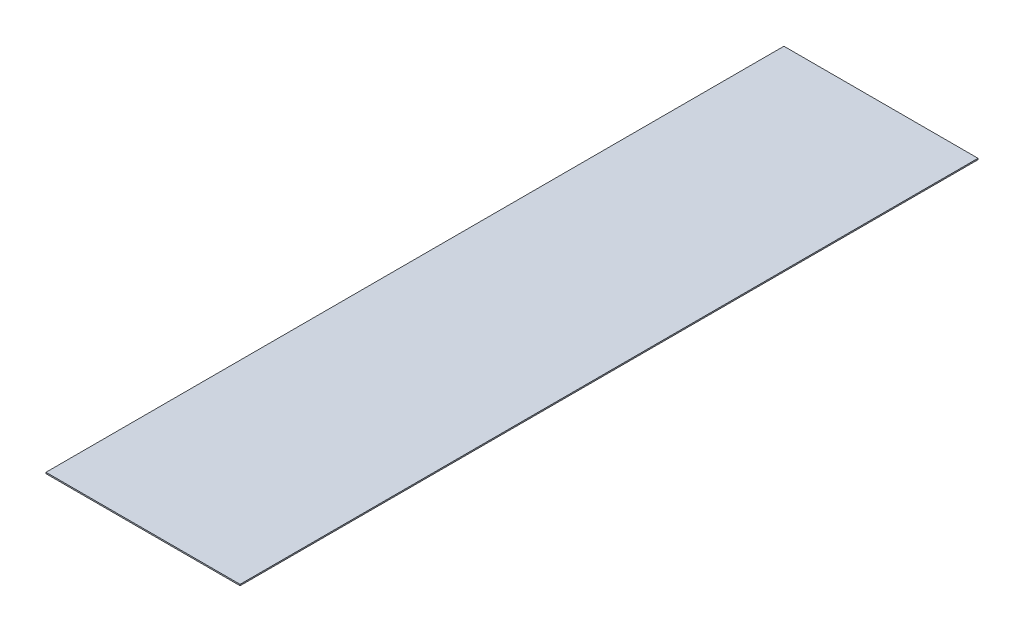
ISO-10303-21;
HEADER;
FILE_DESCRIPTION(('STEP AP214'),'2;1');
FILE_NAME('part.step','',(''),(''),'','','');
FILE_SCHEMA(('AUTOMOTIVE_DESIGN { 1 0 10303 214 1 1 1 1 }'));
ENDSEC;
DATA;
#1=APPLICATION_CONTEXT('core data for automotive mechanical design processes');
#2=APPLICATION_PROTOCOL_DEFINITION('international standard','automotive_design',2000,#1);
#3=PRODUCT_CONTEXT('',#1,'mechanical');
#4=PRODUCT('Part','Part','',(#3));
#5=PRODUCT_RELATED_PRODUCT_CATEGORY('part','',(#4));
#6=PRODUCT_DEFINITION_FORMATION('','',#4);
#7=PRODUCT_DEFINITION_CONTEXT('part definition',#1,'design');
#8=PRODUCT_DEFINITION('design','',#6,#7);
#9=PRODUCT_DEFINITION_SHAPE('','',#8);
#10=(LENGTH_UNIT() NAMED_UNIT(*) SI_UNIT(.MILLI.,.METRE.));
#11=(NAMED_UNIT(*) PLANE_ANGLE_UNIT() SI_UNIT($,.RADIAN.));
#12=(NAMED_UNIT(*) SI_UNIT($,.STERADIAN.) SOLID_ANGLE_UNIT());
#13=UNCERTAINTY_MEASURE_WITH_UNIT(LENGTH_MEASURE(1.E-05),#10,'distance_accuracy_value','');
#14=(GEOMETRIC_REPRESENTATION_CONTEXT(3) GLOBAL_UNCERTAINTY_ASSIGNED_CONTEXT((#13)) GLOBAL_UNIT_ASSIGNED_CONTEXT((#10,
#11,#12)) REPRESENTATION_CONTEXT('',''));
#15=CARTESIAN_POINT('',(0.,0.,0.));
#16=DIRECTION('',(0.,0.,1.));
#17=DIRECTION('',(1.,0.,0.));
#18=AXIS2_PLACEMENT_3D('',#15,#16,#17);
#19=CARTESIAN_POINT('',(240.506249999999,-1.58749999999999,1828.8));
#20=DIRECTION('',(-1.,0.,0.));
#21=DIRECTION('',(0.,0.,1.));
#22=AXIS2_PLACEMENT_3D('',#19,#20,#21);
#23=PLANE('',#22);
#24=DIRECTION('',(0.,1.,0.));
#25=VECTOR('',#24,1.);
#26=CARTESIAN_POINT('',(240.506249999999,-1.58749999999999,0.));
#27=LINE('',#26,#25);
#28=CARTESIAN_POINT('',(240.506249999999,-1.58749999999999,0.));
#29=VERTEX_POINT('',#28);
#30=CARTESIAN_POINT('',(240.506249999999,1.58750000000001,0.));
#31=VERTEX_POINT('',#30);
#32=EDGE_CURVE('E107',#29,#31,#27,.T.);
#33=ORIENTED_EDGE('',*,*,#32,.T.);
#34=DIRECTION('',(0.,0.,-1.));
#35=VECTOR('',#34,1.);
#36=CARTESIAN_POINT('',(240.506249999999,1.58750000000001,1828.8));
#37=LINE('',#36,#35);
#38=CARTESIAN_POINT('',(240.506249999999,1.58750000000001,1828.8));
#39=VERTEX_POINT('',#38);
#40=EDGE_CURVE('E11',#39,#31,#37,.T.);
#41=ORIENTED_EDGE('',*,*,#40,.F.);
#42=DIRECTION('',(0.,1.,0.));
#43=VECTOR('',#42,1.);
#44=CARTESIAN_POINT('',(240.506249999999,-1.58749999999999,1828.8));
#45=LINE('',#44,#43);
#46=CARTESIAN_POINT('',(240.506249999999,-1.58749999999999,1828.8));
#47=VERTEX_POINT('',#46);
#48=EDGE_CURVE('E91',#47,#39,#45,.T.);
#49=ORIENTED_EDGE('',*,*,#48,.F.);
#50=DIRECTION('',(0.,0.,-1.));
#51=VECTOR('',#50,1.);
#52=CARTESIAN_POINT('',(240.506249999999,-1.58749999999999,1828.8));
#53=LINE('',#52,#51);
#54=EDGE_CURVE('E103',#47,#29,#53,.T.);
#55=ORIENTED_EDGE('',*,*,#54,.T.);
#56=EDGE_LOOP('',(#33,#41,#49,#55));
#57=FACE_BOUND('',#56,.T.);
#58=ADVANCED_FACE('F39',(#57),#23,.F.);
#59=CARTESIAN_POINT('',(-240.506250000001,1.58750000000001,1828.8));
#60=DIRECTION('',(0.,-1.,0.));
#61=DIRECTION('',(0.,0.,-1.));
#62=AXIS2_PLACEMENT_3D('',#59,#60,#61);
#63=PLANE('',#62);
#64=DIRECTION('',(-1.,0.,0.));
#65=VECTOR('',#64,1.);
#66=CARTESIAN_POINT('',(-240.506250000001,1.58750000000001,0.));
#67=LINE('',#66,#65);
#68=CARTESIAN_POINT('',(-240.506250000001,1.58750000000001,0.));
#69=VERTEX_POINT('',#68);
#70=EDGE_CURVE('E96',#31,#69,#67,.T.);
#71=ORIENTED_EDGE('',*,*,#70,.T.);
#72=DIRECTION('',(0.,0.,-1.));
#73=VECTOR('',#72,1.);
#74=CARTESIAN_POINT('',(-240.506250000001,1.58750000000001,1828.8));
#75=LINE('',#74,#73);
#76=CARTESIAN_POINT('',(-240.506250000001,1.58750000000001,1828.8));
#77=VERTEX_POINT('',#76);
#78=EDGE_CURVE('E48',#77,#69,#75,.T.);
#79=ORIENTED_EDGE('',*,*,#78,.F.);
#80=DIRECTION('',(-1.,0.,0.));
#81=VECTOR('',#80,1.);
#82=CARTESIAN_POINT('',(-240.506250000001,1.58750000000001,1828.8));
#83=LINE('',#82,#81);
#84=EDGE_CURVE('E86',#39,#77,#83,.T.);
#85=ORIENTED_EDGE('',*,*,#84,.F.);
#86=ORIENTED_EDGE('',*,*,#40,.T.);
#87=EDGE_LOOP('',(#71,#79,#85,#86));
#88=FACE_BOUND('',#87,.T.);
#89=ADVANCED_FACE('F95',(#88),#63,.F.);
#90=CARTESIAN_POINT('',(-240.506250000001,-1.58749999999999,1828.8));
#91=DIRECTION('',(1.,0.,0.));
#92=DIRECTION('',(0.,0.,-1.));
#93=AXIS2_PLACEMENT_3D('',#90,#91,#92);
#94=PLANE('',#93);
#95=DIRECTION('',(0.,-1.,0.));
#96=VECTOR('',#95,1.);
#97=CARTESIAN_POINT('',(-240.506250000001,-1.58749999999999,0.));
#98=LINE('',#97,#96);
#99=CARTESIAN_POINT('',(-240.506250000001,-1.58749999999999,0.));
#100=VERTEX_POINT('',#99);
#101=EDGE_CURVE('E73',#69,#100,#98,.T.);
#102=ORIENTED_EDGE('',*,*,#101,.T.);
#103=DIRECTION('',(0.,0.,-1.));
#104=VECTOR('',#103,1.);
#105=CARTESIAN_POINT('',(-240.506250000001,-1.58749999999999,1828.8));
#106=LINE('',#105,#104);
#107=CARTESIAN_POINT('',(-240.506250000001,-1.58749999999999,1828.8));
#108=VERTEX_POINT('',#107);
#109=EDGE_CURVE('E98',#108,#100,#106,.T.);
#110=ORIENTED_EDGE('',*,*,#109,.F.);
#111=DIRECTION('',(0.,-1.,0.));
#112=VECTOR('',#111,1.);
#113=CARTESIAN_POINT('',(-240.506250000001,-1.58749999999999,1828.8));
#114=LINE('',#113,#112);
#115=EDGE_CURVE('E89',#77,#108,#114,.T.);
#116=ORIENTED_EDGE('',*,*,#115,.F.);
#117=ORIENTED_EDGE('',*,*,#78,.T.);
#118=EDGE_LOOP('',(#102,#110,#116,#117));
#119=FACE_BOUND('',#118,.T.);
#120=ADVANCED_FACE('F99',(#119),#94,.F.);
#121=CARTESIAN_POINT('',(-240.506250000001,-1.58749999999999,1828.8));
#122=DIRECTION('',(0.,1.,0.));
#123=DIRECTION('',(0.,0.,1.));
#124=AXIS2_PLACEMENT_3D('',#121,#122,#123);
#125=PLANE('',#124);
#126=DIRECTION('',(1.,0.,0.));
#127=VECTOR('',#126,1.);
#128=CARTESIAN_POINT('',(-240.506250000001,-1.58749999999999,0.));
#129=LINE('',#128,#127);
#130=EDGE_CURVE('E79',#100,#29,#129,.T.);
#131=ORIENTED_EDGE('',*,*,#130,.T.);
#132=ORIENTED_EDGE('',*,*,#54,.F.);
#133=DIRECTION('',(1.,0.,0.));
#134=VECTOR('',#133,1.);
#135=CARTESIAN_POINT('',(-240.506250000001,-1.58749999999999,1828.8));
#136=LINE('',#135,#134);
#137=EDGE_CURVE('E56',#108,#47,#136,.T.);
#138=ORIENTED_EDGE('',*,*,#137,.F.);
#139=ORIENTED_EDGE('',*,*,#109,.T.);
#140=EDGE_LOOP('',(#131,#132,#138,#139));
#141=FACE_BOUND('',#140,.T.);
#142=ADVANCED_FACE('F120',(#141),#125,.F.);
#143=CARTESIAN_POINT('',(0.,0.,1828.8));
#144=DIRECTION('',(0.,0.,-1.));
#145=DIRECTION('',(-1.,0.,0.));
#146=AXIS2_PLACEMENT_3D('',#143,#144,#145);
#147=PLANE('',#146);
#148=ORIENTED_EDGE('',*,*,#48,.T.);
#149=ORIENTED_EDGE('',*,*,#84,.T.);
#150=ORIENTED_EDGE('',*,*,#115,.T.);
#151=ORIENTED_EDGE('',*,*,#137,.T.);
#152=EDGE_LOOP('',(#148,#149,#150,#151));
#153=FACE_BOUND('',#152,.T.);
#154=ADVANCED_FACE('F87',(#153),#147,.F.);
#155=CARTESIAN_POINT('',(0.,0.,0.));
#156=DIRECTION('',(0.,0.,-1.));
#157=DIRECTION('',(-1.,0.,0.));
#158=AXIS2_PLACEMENT_3D('',#155,#156,#157);
#159=PLANE('',#158);
#160=ORIENTED_EDGE('',*,*,#32,.F.);
#161=ORIENTED_EDGE('',*,*,#130,.F.);
#162=ORIENTED_EDGE('',*,*,#101,.F.);
#163=ORIENTED_EDGE('',*,*,#70,.F.);
#164=EDGE_LOOP('',(#160,#161,#162,#163));
#165=FACE_BOUND('',#164,.T.);
#166=ADVANCED_FACE('F123',(#165),#159,.T.);
#167=CLOSED_SHELL('',(#58,#89,#120,#142,#154,#166));
#168=MANIFOLD_SOLID_BREP('B2',#167);
#169=ADVANCED_BREP_SHAPE_REPRESENTATION('',(#18,#168),#14);
#170=SHAPE_DEFINITION_REPRESENTATION(#9,#169);
ENDSEC;
END-ISO-10303-21;
